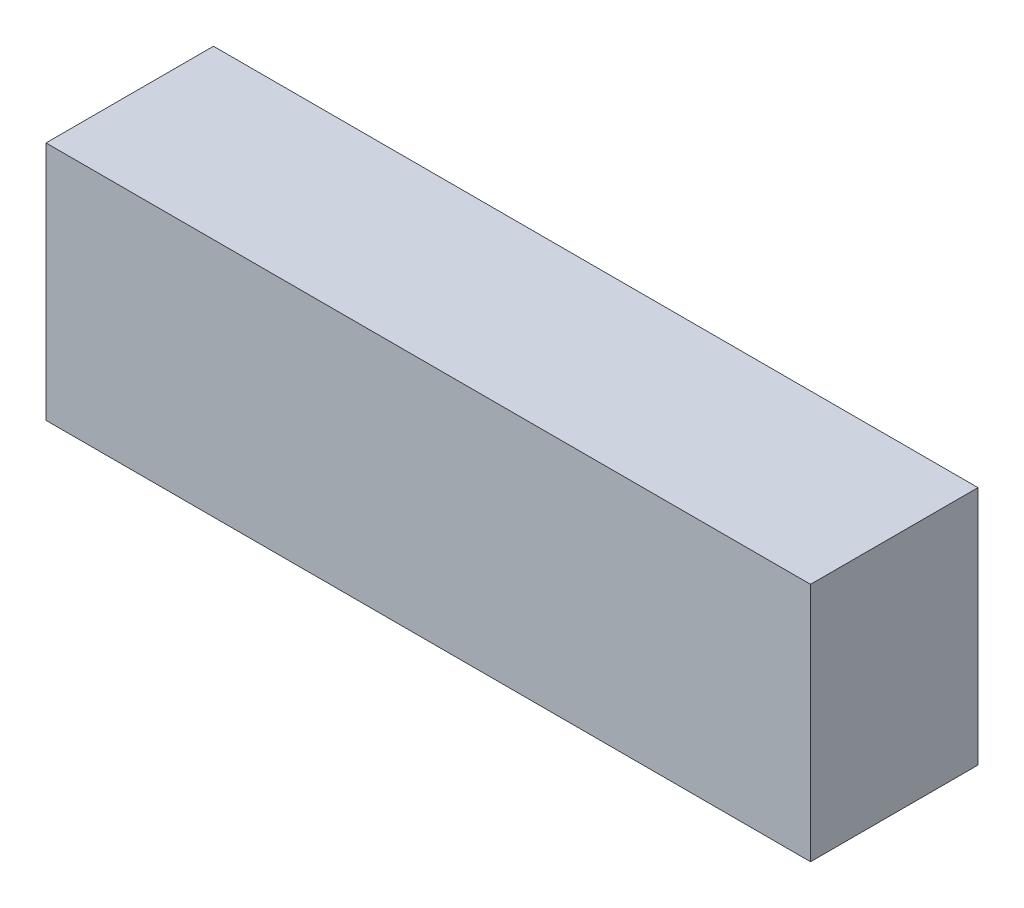
ISO-10303-21;
HEADER;
FILE_DESCRIPTION(('STEP AP214'),'2;1');
FILE_NAME('part.step','',(''),(''),'','','');
FILE_SCHEMA(('AUTOMOTIVE_DESIGN { 1 0 10303 214 1 1 1 1 }'));
ENDSEC;
DATA;
#1=APPLICATION_CONTEXT('core data for automotive mechanical design processes');
#2=APPLICATION_PROTOCOL_DEFINITION('international standard','automotive_design',2000,#1);
#3=PRODUCT_CONTEXT('',#1,'mechanical');
#4=PRODUCT('Part','Part','',(#3));
#5=PRODUCT_RELATED_PRODUCT_CATEGORY('part','',(#4));
#6=PRODUCT_DEFINITION_FORMATION('','',#4);
#7=PRODUCT_DEFINITION_CONTEXT('part definition',#1,'design');
#8=PRODUCT_DEFINITION('design','',#6,#7);
#9=PRODUCT_DEFINITION_SHAPE('','',#8);
#10=(LENGTH_UNIT() NAMED_UNIT(*) SI_UNIT(.MILLI.,.METRE.));
#11=(NAMED_UNIT(*) PLANE_ANGLE_UNIT() SI_UNIT($,.RADIAN.));
#12=(NAMED_UNIT(*) SI_UNIT($,.STERADIAN.) SOLID_ANGLE_UNIT());
#13=UNCERTAINTY_MEASURE_WITH_UNIT(LENGTH_MEASURE(1.E-05),#10,'distance_accuracy_value','');
#14=(GEOMETRIC_REPRESENTATION_CONTEXT(3) GLOBAL_UNCERTAINTY_ASSIGNED_CONTEXT((#13)) GLOBAL_UNIT_ASSIGNED_CONTEXT((#10,
#11,#12)) REPRESENTATION_CONTEXT('',''));
#15=CARTESIAN_POINT('',(0.,0.,0.));
#16=DIRECTION('',(0.,0.,1.));
#17=DIRECTION('',(1.,0.,0.));
#18=AXIS2_PLACEMENT_3D('',#15,#16,#17);
#19=CARTESIAN_POINT('',(52.5,16.5,23.));
#20=DIRECTION('',(-1.,0.,0.));
#21=DIRECTION('',(0.,-1.,0.));
#22=AXIS2_PLACEMENT_3D('',#19,#20,#21);
#23=PLANE('',#22);
#24=DIRECTION('',(0.,1.,0.));
#25=VECTOR('',#24,1.);
#26=CARTESIAN_POINT('',(52.5,16.5,0.));
#27=LINE('',#26,#25);
#28=CARTESIAN_POINT('',(52.5,-16.5,0.));
#29=VERTEX_POINT('',#28);
#30=CARTESIAN_POINT('',(52.5,16.5,0.));
#31=VERTEX_POINT('',#30);
#32=EDGE_CURVE('E97',#29,#31,#27,.T.);
#33=ORIENTED_EDGE('',*,*,#32,.T.);
#34=DIRECTION('',(0.,0.,-1.));
#35=VECTOR('',#34,1.);
#36=CARTESIAN_POINT('',(52.5,16.5,23.));
#37=LINE('',#36,#35);
#38=CARTESIAN_POINT('',(52.5,16.5,23.));
#39=VERTEX_POINT('',#38);
#40=EDGE_CURVE('E11',#39,#31,#37,.T.);
#41=ORIENTED_EDGE('',*,*,#40,.F.);
#42=DIRECTION('',(0.,1.,0.));
#43=VECTOR('',#42,1.);
#44=CARTESIAN_POINT('',(52.5,16.5,23.));
#45=LINE('',#44,#43);
#46=CARTESIAN_POINT('',(52.5,-16.5,23.));
#47=VERTEX_POINT('',#46);
#48=EDGE_CURVE('E85',#47,#39,#45,.T.);
#49=ORIENTED_EDGE('',*,*,#48,.F.);
#50=DIRECTION('',(0.,0.,-1.));
#51=VECTOR('',#50,1.);
#52=CARTESIAN_POINT('',(52.5,-16.5,23.));
#53=LINE('',#52,#51);
#54=EDGE_CURVE('E93',#47,#29,#53,.T.);
#55=ORIENTED_EDGE('',*,*,#54,.T.);
#56=EDGE_LOOP('',(#33,#41,#49,#55));
#57=FACE_BOUND('',#56,.T.);
#58=ADVANCED_FACE('F34',(#57),#23,.F.);
#59=CARTESIAN_POINT('',(-52.5,16.5,23.));
#60=DIRECTION('',(0.,-1.,0.));
#61=DIRECTION('',(0.,0.,-1.));
#62=AXIS2_PLACEMENT_3D('',#59,#60,#61);
#63=PLANE('',#62);
#64=DIRECTION('',(-1.,0.,0.));
#65=VECTOR('',#64,1.);
#66=CARTESIAN_POINT('',(-52.5,16.5,0.));
#67=LINE('',#66,#65);
#68=CARTESIAN_POINT('',(-52.5,16.5,0.));
#69=VERTEX_POINT('',#68);
#70=EDGE_CURVE('E89',#31,#69,#67,.T.);
#71=ORIENTED_EDGE('',*,*,#70,.T.);
#72=DIRECTION('',(0.,0.,-1.));
#73=VECTOR('',#72,1.);
#74=CARTESIAN_POINT('',(-52.5,16.5,23.));
#75=LINE('',#74,#73);
#76=CARTESIAN_POINT('',(-52.5,16.5,23.));
#77=VERTEX_POINT('',#76);
#78=EDGE_CURVE('E42',#77,#69,#75,.T.);
#79=ORIENTED_EDGE('',*,*,#78,.F.);
#80=DIRECTION('',(-1.,0.,0.));
#81=VECTOR('',#80,1.);
#82=CARTESIAN_POINT('',(-52.5,16.5,23.));
#83=LINE('',#82,#81);
#84=EDGE_CURVE('E80',#39,#77,#83,.T.);
#85=ORIENTED_EDGE('',*,*,#84,.F.);
#86=ORIENTED_EDGE('',*,*,#40,.T.);
#87=EDGE_LOOP('',(#71,#79,#85,#86));
#88=FACE_BOUND('',#87,.T.);
#89=ADVANCED_FACE('F88',(#88),#63,.F.);
#90=CARTESIAN_POINT('',(-52.5,16.5,23.));
#91=DIRECTION('',(1.,0.,0.));
#92=DIRECTION('',(0.,1.,0.));
#93=AXIS2_PLACEMENT_3D('',#90,#91,#92);
#94=PLANE('',#93);
#95=DIRECTION('',(0.,-1.,0.));
#96=VECTOR('',#95,1.);
#97=CARTESIAN_POINT('',(-52.5,16.5,0.));
#98=LINE('',#97,#96);
#99=CARTESIAN_POINT('',(-52.5,-16.5,0.));
#100=VERTEX_POINT('',#99);
#101=EDGE_CURVE('E67',#69,#100,#98,.T.);
#102=ORIENTED_EDGE('',*,*,#101,.T.);
#103=DIRECTION('',(0.,0.,-1.));
#104=VECTOR('',#103,1.);
#105=CARTESIAN_POINT('',(-52.5,-16.5,23.));
#106=LINE('',#105,#104);
#107=CARTESIAN_POINT('',(-52.5,-16.5,23.));
#108=VERTEX_POINT('',#107);
#109=EDGE_CURVE('E90',#108,#100,#106,.T.);
#110=ORIENTED_EDGE('',*,*,#109,.F.);
#111=DIRECTION('',(0.,-1.,0.));
#112=VECTOR('',#111,1.);
#113=CARTESIAN_POINT('',(-52.5,16.5,23.));
#114=LINE('',#113,#112);
#115=EDGE_CURVE('E83',#77,#108,#114,.T.);
#116=ORIENTED_EDGE('',*,*,#115,.F.);
#117=ORIENTED_EDGE('',*,*,#78,.T.);
#118=EDGE_LOOP('',(#102,#110,#116,#117));
#119=FACE_BOUND('',#118,.T.);
#120=ADVANCED_FACE('F91',(#119),#94,.F.);
#121=CARTESIAN_POINT('',(-52.5,-16.5,23.));
#122=DIRECTION('',(0.,1.,0.));
#123=DIRECTION('',(0.,0.,1.));
#124=AXIS2_PLACEMENT_3D('',#121,#122,#123);
#125=PLANE('',#124);
#126=DIRECTION('',(1.,0.,0.));
#127=VECTOR('',#126,1.);
#128=CARTESIAN_POINT('',(-52.5,-16.5,0.));
#129=LINE('',#128,#127);
#130=EDGE_CURVE('E73',#100,#29,#129,.T.);
#131=ORIENTED_EDGE('',*,*,#130,.T.);
#132=ORIENTED_EDGE('',*,*,#54,.F.);
#133=DIRECTION('',(1.,0.,0.));
#134=VECTOR('',#133,1.);
#135=CARTESIAN_POINT('',(-52.5,-16.5,23.));
#136=LINE('',#135,#134);
#137=EDGE_CURVE('E50',#108,#47,#136,.T.);
#138=ORIENTED_EDGE('',*,*,#137,.F.);
#139=ORIENTED_EDGE('',*,*,#109,.T.);
#140=EDGE_LOOP('',(#131,#132,#138,#139));
#141=FACE_BOUND('',#140,.T.);
#142=ADVANCED_FACE('F104',(#141),#125,.F.);
#143=CARTESIAN_POINT('',(0.,0.,23.));
#144=DIRECTION('',(0.,0.,1.));
#145=DIRECTION('',(1.,0.,0.));
#146=AXIS2_PLACEMENT_3D('',#143,#144,#145);
#147=PLANE('',#146);
#148=ORIENTED_EDGE('',*,*,#48,.T.);
#149=ORIENTED_EDGE('',*,*,#84,.T.);
#150=ORIENTED_EDGE('',*,*,#115,.T.);
#151=ORIENTED_EDGE('',*,*,#137,.T.);
#152=EDGE_LOOP('',(#148,#149,#150,#151));
#153=FACE_BOUND('',#152,.T.);
#154=ADVANCED_FACE('F81',(#153),#147,.T.);
#155=CARTESIAN_POINT('',(0.,0.,0.));
#156=DIRECTION('',(0.,0.,1.));
#157=DIRECTION('',(1.,0.,0.));
#158=AXIS2_PLACEMENT_3D('',#155,#156,#157);
#159=PLANE('',#158);
#160=ORIENTED_EDGE('',*,*,#32,.F.);
#161=ORIENTED_EDGE('',*,*,#130,.F.);
#162=ORIENTED_EDGE('',*,*,#101,.F.);
#163=ORIENTED_EDGE('',*,*,#70,.F.);
#164=EDGE_LOOP('',(#160,#161,#162,#163));
#165=FACE_BOUND('',#164,.T.);
#166=ADVANCED_FACE('F107',(#165),#159,.F.);
#167=CLOSED_SHELL('',(#58,#89,#120,#142,#154,#166));
#168=MANIFOLD_SOLID_BREP('B2',#167);
#169=ADVANCED_BREP_SHAPE_REPRESENTATION('',(#18,#168),#14);
#170=SHAPE_DEFINITION_REPRESENTATION(#9,#169);
ENDSEC;
END-ISO-10303-21;
